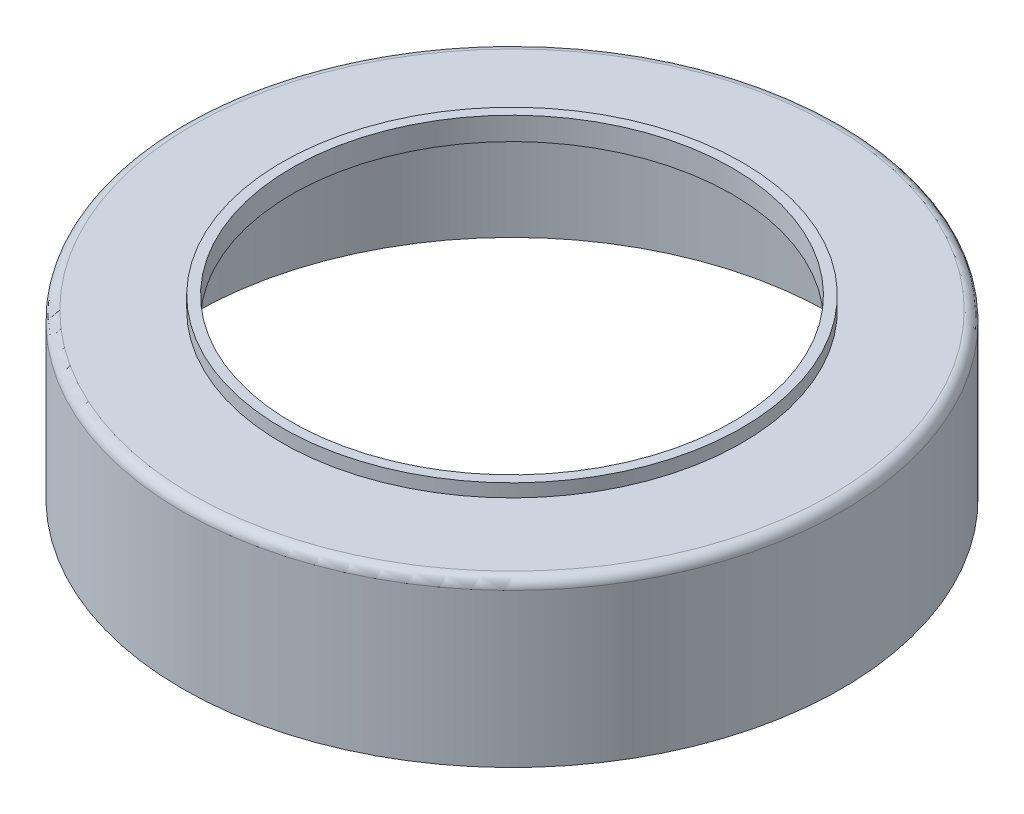
ISO-10303-21;
HEADER;
FILE_DESCRIPTION(('STEP AP214'),'2;1');
FILE_NAME('part.step','',(''),(''),'','','');
FILE_SCHEMA(('AUTOMOTIVE_DESIGN { 1 0 10303 214 1 1 1 1 }'));
ENDSEC;
DATA;
#1=APPLICATION_CONTEXT('core data for automotive mechanical design processes');
#2=APPLICATION_PROTOCOL_DEFINITION('international standard','automotive_design',2000,#1);
#3=PRODUCT_CONTEXT('',#1,'mechanical');
#4=PRODUCT('Part','Part','',(#3));
#5=PRODUCT_RELATED_PRODUCT_CATEGORY('part','',(#4));
#6=PRODUCT_DEFINITION_FORMATION('','',#4);
#7=PRODUCT_DEFINITION_CONTEXT('part definition',#1,'design');
#8=PRODUCT_DEFINITION('design','',#6,#7);
#9=PRODUCT_DEFINITION_SHAPE('','',#8);
#10=(LENGTH_UNIT() NAMED_UNIT(*) SI_UNIT(.MILLI.,.METRE.));
#11=(NAMED_UNIT(*) PLANE_ANGLE_UNIT() SI_UNIT($,.RADIAN.));
#12=(NAMED_UNIT(*) SI_UNIT($,.STERADIAN.) SOLID_ANGLE_UNIT());
#13=UNCERTAINTY_MEASURE_WITH_UNIT(LENGTH_MEASURE(1.E-05),#10,'distance_accuracy_value','');
#14=(GEOMETRIC_REPRESENTATION_CONTEXT(3) GLOBAL_UNCERTAINTY_ASSIGNED_CONTEXT((#13)) GLOBAL_UNIT_ASSIGNED_CONTEXT((#10,
#11,#12)) REPRESENTATION_CONTEXT('',''));
#15=CARTESIAN_POINT('',(0.,0.,0.));
#16=DIRECTION('',(0.,0.,1.));
#17=DIRECTION('',(1.,0.,0.));
#18=AXIS2_PLACEMENT_3D('',#15,#16,#17);
#19=CARTESIAN_POINT('',(0.,0.,0.));
#20=DIRECTION('',(0.,-1.,0.));
#21=DIRECTION('',(0.,0.,-1.));
#22=AXIS2_PLACEMENT_3D('',#19,#20,#21);
#23=CYLINDRICAL_SURFACE('',#22,490.);
#24=CARTESIAN_POINT('',(0.,-70.,0.));
#25=DIRECTION('',(0.,-1.,0.));
#26=DIRECTION('',(0.,0.,-1.));
#27=AXIS2_PLACEMENT_3D('',#24,#25,#26);
#28=CIRCLE('',#27,490.);
#29=CARTESIAN_POINT('',(0.,-70.,-490.));
#30=VERTEX_POINT('',#29);
#31=EDGE_CURVE('E76',#30,#30,#28,.T.);
#32=ORIENTED_EDGE('',*,*,#31,.T.);
#33=EDGE_LOOP('',(#32));
#34=FACE_BOUND('',#33,.T.);
#35=CARTESIAN_POINT('',(0.,165.,0.));
#36=DIRECTION('',(0.,-1.,0.));
#37=DIRECTION('',(0.,0.,-1.));
#38=AXIS2_PLACEMENT_3D('',#35,#36,#37);
#39=CIRCLE('',#38,490.);
#40=CARTESIAN_POINT('',(0.,165.,-490.));
#41=VERTEX_POINT('',#40);
#42=EDGE_CURVE('E10',#41,#41,#39,.T.);
#43=ORIENTED_EDGE('',*,*,#42,.F.);
#44=EDGE_LOOP('',(#43));
#45=FACE_BOUND('',#44,.T.);
#46=ADVANCED_FACE('F37',(#34,#45),#23,.F.);
#47=CARTESIAN_POINT('',(337.5,165.,0.));
#48=DIRECTION('',(0.,-1.,0.));
#49=DIRECTION('',(0.,0.,-1.));
#50=AXIS2_PLACEMENT_3D('',#47,#48,#49);
#51=PLANE('',#50);
#52=ORIENTED_EDGE('',*,*,#42,.T.);
#53=EDGE_LOOP('',(#52));
#54=FACE_BOUND('',#53,.T.);
#55=CARTESIAN_POINT('',(0.,165.,0.));
#56=DIRECTION('',(0.,-1.,0.));
#57=DIRECTION('',(0.,0.,-1.));
#58=AXIS2_PLACEMENT_3D('',#55,#56,#57);
#59=CIRCLE('',#58,337.5);
#60=CARTESIAN_POINT('',(0.,165.,-337.5));
#61=VERTEX_POINT('',#60);
#62=EDGE_CURVE('E44',#61,#61,#59,.T.);
#63=ORIENTED_EDGE('',*,*,#62,.F.);
#64=EDGE_LOOP('',(#63));
#65=FACE_BOUND('',#64,.T.);
#66=ADVANCED_FACE('F95',(#54,#65),#51,.T.);
#67=CARTESIAN_POINT('',(0.,0.,0.));
#68=DIRECTION('',(0.,-1.,0.));
#69=DIRECTION('',(0.,0.,-1.));
#70=AXIS2_PLACEMENT_3D('',#67,#68,#69);
#71=CYLINDRICAL_SURFACE('',#70,337.5);
#72=ORIENTED_EDGE('',*,*,#62,.T.);
#73=EDGE_LOOP('',(#72));
#74=FACE_BOUND('',#73,.T.);
#75=CARTESIAN_POINT('',(0.,200.,0.));
#76=DIRECTION('',(0.,-1.,0.));
#77=DIRECTION('',(0.,0.,-1.));
#78=AXIS2_PLACEMENT_3D('',#75,#76,#77);
#79=CIRCLE('',#78,337.5);
#80=CARTESIAN_POINT('',(0.,200.,-337.5));
#81=VERTEX_POINT('',#80);
#82=EDGE_CURVE('E49',#81,#81,#79,.T.);
#83=ORIENTED_EDGE('',*,*,#82,.F.);
#84=EDGE_LOOP('',(#83));
#85=FACE_BOUND('',#84,.T.);
#86=ADVANCED_FACE('F99',(#74,#85),#71,.F.);
#87=CARTESIAN_POINT('',(337.5,200.,0.));
#88=DIRECTION('',(0.,1.,0.));
#89=DIRECTION('',(0.,0.,1.));
#90=AXIS2_PLACEMENT_3D('',#87,#88,#89);
#91=PLANE('',#90);
#92=ORIENTED_EDGE('',*,*,#82,.T.);
#93=EDGE_LOOP('',(#92));
#94=FACE_BOUND('',#93,.T.);
#95=CARTESIAN_POINT('',(0.,200.,0.));
#96=DIRECTION('',(0.,-1.,0.));
#97=DIRECTION('',(0.,0.,-1.));
#98=AXIS2_PLACEMENT_3D('',#95,#96,#97);
#99=CIRCLE('',#98,352.5);
#100=CARTESIAN_POINT('',(0.,200.,-352.5));
#101=VERTEX_POINT('',#100);
#102=EDGE_CURVE('E54',#101,#101,#99,.T.);
#103=ORIENTED_EDGE('',*,*,#102,.F.);
#104=EDGE_LOOP('',(#103));
#105=FACE_BOUND('',#104,.T.);
#106=ADVANCED_FACE('F103',(#94,#105),#91,.T.);
#107=CARTESIAN_POINT('',(0.,0.,0.));
#108=DIRECTION('',(0.,-1.,0.));
#109=DIRECTION('',(0.,0.,-1.));
#110=AXIS2_PLACEMENT_3D('',#107,#108,#109);
#111=CYLINDRICAL_SURFACE('',#110,352.5);
#112=ORIENTED_EDGE('',*,*,#102,.T.);
#113=EDGE_LOOP('',(#112));
#114=FACE_BOUND('',#113,.T.);
#115=CARTESIAN_POINT('',(0.,180.,0.));
#116=DIRECTION('',(0.,-1.,0.));
#117=DIRECTION('',(0.,0.,-1.));
#118=AXIS2_PLACEMENT_3D('',#115,#116,#117);
#119=CIRCLE('',#118,352.5);
#120=CARTESIAN_POINT('',(0.,180.,-352.5));
#121=VERTEX_POINT('',#120);
#122=EDGE_CURVE('E60',#121,#121,#119,.T.);
#123=ORIENTED_EDGE('',*,*,#122,.F.);
#124=EDGE_LOOP('',(#123));
#125=FACE_BOUND('',#124,.T.);
#126=ADVANCED_FACE('F109',(#114,#125),#111,.T.);
#127=CARTESIAN_POINT('',(352.5,180.,0.));
#128=DIRECTION('',(0.,1.,0.));
#129=DIRECTION('',(0.,0.,1.));
#130=AXIS2_PLACEMENT_3D('',#127,#128,#129);
#131=PLANE('',#130);
#132=ORIENTED_EDGE('',*,*,#122,.T.);
#133=EDGE_LOOP('',(#132));
#134=FACE_BOUND('',#133,.T.);
#135=CARTESIAN_POINT('',(0.,180.,0.));
#136=DIRECTION('',(0.,-1.,0.));
#137=DIRECTION('',(0.,0.,-1.));
#138=AXIS2_PLACEMENT_3D('',#135,#136,#137);
#139=CIRCLE('',#138,490.);
#140=CARTESIAN_POINT('',(0.,180.,-490.));
#141=VERTEX_POINT('',#140);
#142=EDGE_CURVE('E64',#141,#141,#139,.T.);
#143=ORIENTED_EDGE('',*,*,#142,.F.);
#144=EDGE_LOOP('',(#143));
#145=FACE_BOUND('',#144,.T.);
#146=ADVANCED_FACE('F113',(#134,#145),#131,.T.);
#147=CARTESIAN_POINT('',(0.,165.,0.));
#148=DIRECTION('',(0.,-1.,0.));
#149=DIRECTION('',(0.,0.,-1.));
#150=AXIS2_PLACEMENT_3D('',#147,#148,#149);
#151=TOROIDAL_SURFACE('',#150,490.,15.);
#152=ORIENTED_EDGE('',*,*,#142,.T.);
#153=EDGE_LOOP('',(#152));
#154=FACE_BOUND('',#153,.T.);
#155=CARTESIAN_POINT('',(0.,165.,0.));
#156=DIRECTION('',(0.,-1.,0.));
#157=DIRECTION('',(0.,0.,-1.));
#158=AXIS2_PLACEMENT_3D('',#155,#156,#157);
#159=CIRCLE('',#158,505.);
#160=CARTESIAN_POINT('',(0.,165.,-505.));
#161=VERTEX_POINT('',#160);
#162=EDGE_CURVE('E68',#161,#161,#159,.T.);
#163=ORIENTED_EDGE('',*,*,#162,.F.);
#164=EDGE_LOOP('',(#163));
#165=FACE_BOUND('',#164,.T.);
#166=ADVANCED_FACE('F91',(#154,#165),#151,.T.);
#167=CARTESIAN_POINT('',(0.,0.,0.));
#168=DIRECTION('',(0.,-1.,0.));
#169=DIRECTION('',(0.,0.,-1.));
#170=AXIS2_PLACEMENT_3D('',#167,#168,#169);
#171=CYLINDRICAL_SURFACE('',#170,505.);
#172=ORIENTED_EDGE('',*,*,#162,.T.);
#173=EDGE_LOOP('',(#172));
#174=FACE_BOUND('',#173,.T.);
#175=CARTESIAN_POINT('',(0.,-70.,0.));
#176=DIRECTION('',(0.,-1.,0.));
#177=DIRECTION('',(0.,0.,-1.));
#178=AXIS2_PLACEMENT_3D('',#175,#176,#177);
#179=CIRCLE('',#178,505.);
#180=CARTESIAN_POINT('',(0.,-70.,-505.));
#181=VERTEX_POINT('',#180);
#182=EDGE_CURVE('E72',#181,#181,#179,.T.);
#183=ORIENTED_EDGE('',*,*,#182,.F.);
#184=EDGE_LOOP('',(#183));
#185=FACE_BOUND('',#184,.T.);
#186=ADVANCED_FACE('F85',(#174,#185),#171,.T.);
#187=CARTESIAN_POINT('',(490.,-70.,0.));
#188=DIRECTION('',(0.,-1.,0.));
#189=DIRECTION('',(0.,0.,-1.));
#190=AXIS2_PLACEMENT_3D('',#187,#188,#189);
#191=PLANE('',#190);
#192=ORIENTED_EDGE('',*,*,#182,.T.);
#193=EDGE_LOOP('',(#192));
#194=FACE_BOUND('',#193,.T.);
#195=ORIENTED_EDGE('',*,*,#31,.F.);
#196=EDGE_LOOP('',(#195));
#197=FACE_BOUND('',#196,.T.);
#198=ADVANCED_FACE('F83',(#194,#197),#191,.T.);
#199=CLOSED_SHELL('',(#46,#66,#86,#106,#126,#146,#166,#186,#198));
#200=MANIFOLD_SOLID_BREP('B2',#199);
#201=ADVANCED_BREP_SHAPE_REPRESENTATION('',(#18,#200),#14);
#202=SHAPE_DEFINITION_REPRESENTATION(#9,#201);
ENDSEC;
END-ISO-10303-21;
